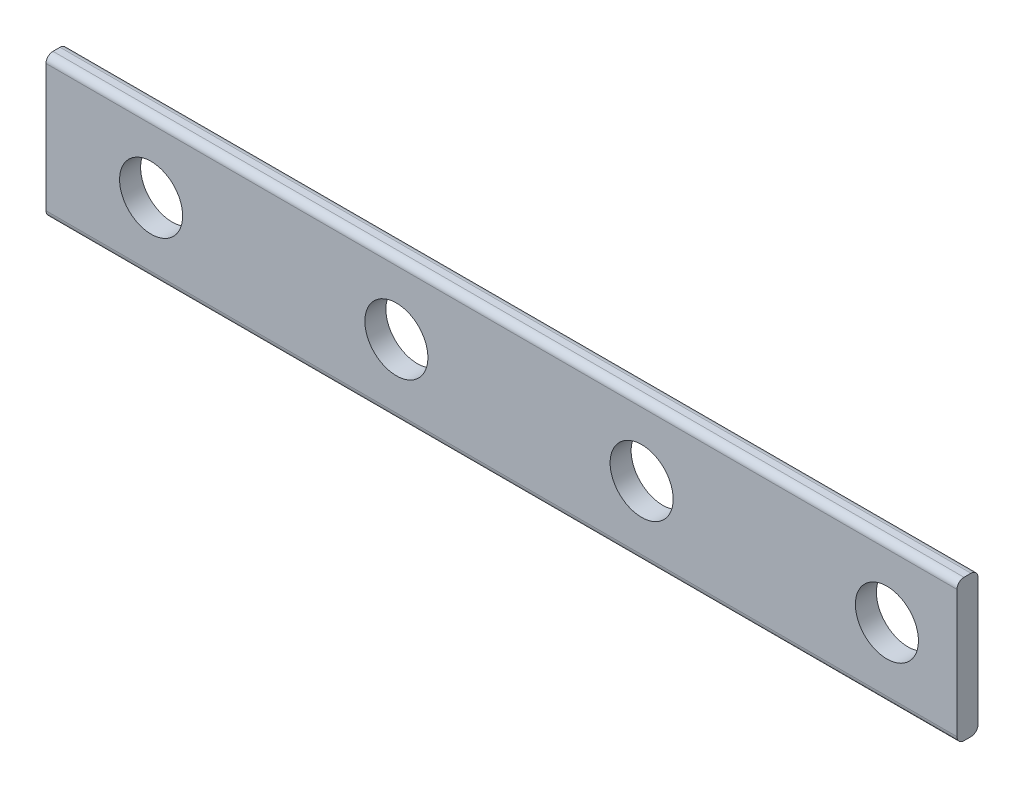
ISO-10303-21;
HEADER;
FILE_DESCRIPTION(('STEP AP214'),'2;1');
FILE_NAME('part.step','',(''),(''),'','','');
FILE_SCHEMA(('AUTOMOTIVE_DESIGN { 1 0 10303 214 1 1 1 1 }'));
ENDSEC;
DATA;
#1=APPLICATION_CONTEXT('core data for automotive mechanical design processes');
#2=APPLICATION_PROTOCOL_DEFINITION('international standard','automotive_design',2000,#1);
#3=PRODUCT_CONTEXT('',#1,'mechanical');
#4=PRODUCT('Part','Part','',(#3));
#5=PRODUCT_RELATED_PRODUCT_CATEGORY('part','',(#4));
#6=PRODUCT_DEFINITION_FORMATION('','',#4);
#7=PRODUCT_DEFINITION_CONTEXT('part definition',#1,'design');
#8=PRODUCT_DEFINITION('design','',#6,#7);
#9=PRODUCT_DEFINITION_SHAPE('','',#8);
#10=(LENGTH_UNIT() NAMED_UNIT(*) SI_UNIT(.MILLI.,.METRE.));
#11=(NAMED_UNIT(*) PLANE_ANGLE_UNIT() SI_UNIT($,.RADIAN.));
#12=(NAMED_UNIT(*) SI_UNIT($,.STERADIAN.) SOLID_ANGLE_UNIT());
#13=UNCERTAINTY_MEASURE_WITH_UNIT(LENGTH_MEASURE(1.E-05),#10,'distance_accuracy_value','');
#14=(GEOMETRIC_REPRESENTATION_CONTEXT(3) GLOBAL_UNCERTAINTY_ASSIGNED_CONTEXT((#13)) GLOBAL_UNIT_ASSIGNED_CONTEXT((#10,
#11,#12)) REPRESENTATION_CONTEXT('',''));
#15=CARTESIAN_POINT('',(0.,0.,0.));
#16=DIRECTION('',(0.,0.,1.));
#17=DIRECTION('',(1.,0.,0.));
#18=AXIS2_PLACEMENT_3D('',#15,#16,#17);
#19=CARTESIAN_POINT('',(0.,0.,3.));
#20=DIRECTION('',(0.,0.,1.));
#21=DIRECTION('',(1.,0.,0.));
#22=AXIS2_PLACEMENT_3D('',#19,#20,#21);
#23=PLANE('',#22);
#24=CARTESIAN_POINT('',(20.,0.,3.));
#25=DIRECTION('',(0.,0.,1.));
#26=DIRECTION('',(1.,0.,0.));
#27=AXIS2_PLACEMENT_3D('',#24,#25,#26);
#28=CIRCLE('',#27,4.5);
#29=CARTESIAN_POINT('',(24.5,0.,3.));
#30=VERTEX_POINT('',#29);
#31=EDGE_CURVE('E252',#30,#30,#28,.T.);
#32=ORIENTED_EDGE('',*,*,#31,.F.);
#33=EDGE_LOOP('',(#32));
#34=FACE_BOUND('',#33,.T.);
#35=CARTESIAN_POINT('',(-50.,0.,3.));
#36=DIRECTION('',(0.,0.,1.));
#37=DIRECTION('',(1.,0.,0.));
#38=AXIS2_PLACEMENT_3D('',#35,#36,#37);
#39=CIRCLE('',#38,4.5);
#40=CARTESIAN_POINT('',(-45.5,0.,3.));
#41=VERTEX_POINT('',#40);
#42=EDGE_CURVE('E183',#41,#41,#39,.T.);
#43=ORIENTED_EDGE('',*,*,#42,.F.);
#44=EDGE_LOOP('',(#43));
#45=FACE_BOUND('',#44,.T.);
#46=DIRECTION('',(0.,1.,0.));
#47=VECTOR('',#46,1.);
#48=CARTESIAN_POINT('',(65.,10.1,3.));
#49=LINE('',#48,#47);
#50=CARTESIAN_POINT('',(65.,-9.09999999999999,3.));
#51=VERTEX_POINT('',#50);
#52=CARTESIAN_POINT('',(65.,9.10000000000001,3.));
#53=VERTEX_POINT('',#52);
#54=EDGE_CURVE('E171',#51,#53,#49,.T.);
#55=ORIENTED_EDGE('',*,*,#54,.T.);
#56=DIRECTION('',(-1.,0.,0.));
#57=VECTOR('',#56,1.);
#58=CARTESIAN_POINT('',(-65.,9.09999999999999,3.));
#59=LINE('',#58,#57);
#60=CARTESIAN_POINT('',(-65.,9.09999999999999,3.));
#61=VERTEX_POINT('',#60);
#62=EDGE_CURVE('E155',#53,#61,#59,.T.);
#63=ORIENTED_EDGE('',*,*,#62,.T.);
#64=DIRECTION('',(0.,-1.,0.));
#65=VECTOR('',#64,1.);
#66=CARTESIAN_POINT('',(-65.,10.1,3.));
#67=LINE('',#66,#65);
#68=CARTESIAN_POINT('',(-65.,-9.09999999999999,3.));
#69=VERTEX_POINT('',#68);
#70=EDGE_CURVE('E113',#61,#69,#67,.T.);
#71=ORIENTED_EDGE('',*,*,#70,.T.);
#72=DIRECTION('',(1.,0.,0.));
#73=VECTOR('',#72,1.);
#74=CARTESIAN_POINT('',(65.,-9.09999999999999,3.));
#75=LINE('',#74,#73);
#76=EDGE_CURVE('E152',#69,#51,#75,.T.);
#77=ORIENTED_EDGE('',*,*,#76,.T.);
#78=EDGE_LOOP('',(#55,#63,#71,#77));
#79=FACE_BOUND('',#78,.T.);
#80=CARTESIAN_POINT('',(-15.,0.,3.));
#81=DIRECTION('',(0.,0.,1.));
#82=DIRECTION('',(1.,0.,0.));
#83=AXIS2_PLACEMENT_3D('',#80,#81,#82);
#84=CIRCLE('',#83,4.5);
#85=CARTESIAN_POINT('',(-10.5,0.,3.));
#86=VERTEX_POINT('',#85);
#87=EDGE_CURVE('E247',#86,#86,#84,.T.);
#88=ORIENTED_EDGE('',*,*,#87,.F.);
#89=EDGE_LOOP('',(#88));
#90=FACE_BOUND('',#89,.T.);
#91=CARTESIAN_POINT('',(55.,0.,3.));
#92=DIRECTION('',(0.,0.,1.));
#93=DIRECTION('',(1.,0.,0.));
#94=AXIS2_PLACEMENT_3D('',#91,#92,#93);
#95=CIRCLE('',#94,4.5);
#96=CARTESIAN_POINT('',(59.5,0.,3.));
#97=VERTEX_POINT('',#96);
#98=EDGE_CURVE('E271',#97,#97,#95,.T.);
#99=ORIENTED_EDGE('',*,*,#98,.F.);
#100=EDGE_LOOP('',(#99));
#101=FACE_BOUND('',#100,.T.);
#102=ADVANCED_FACE('F42',(#34,#45,#79,#90,#101),#23,.T.);
#103=CARTESIAN_POINT('',(0.,0.,0.));
#104=DIRECTION('',(0.,0.,1.));
#105=DIRECTION('',(1.,0.,0.));
#106=AXIS2_PLACEMENT_3D('',#103,#104,#105);
#107=PLANE('',#106);
#108=DIRECTION('',(0.,-1.,0.));
#109=VECTOR('',#108,1.);
#110=CARTESIAN_POINT('',(-65.,10.1,0.));
#111=LINE('',#110,#109);
#112=CARTESIAN_POINT('',(-65.,9.09999999999999,0.));
#113=VERTEX_POINT('',#112);
#114=CARTESIAN_POINT('',(-65.,-9.09999999999999,0.));
#115=VERTEX_POINT('',#114);
#116=EDGE_CURVE('E174',#113,#115,#111,.T.);
#117=ORIENTED_EDGE('',*,*,#116,.F.);
#118=DIRECTION('',(-1.,0.,0.));
#119=VECTOR('',#118,1.);
#120=CARTESIAN_POINT('',(0.,9.1,0.));
#121=LINE('',#120,#119);
#122=CARTESIAN_POINT('',(65.,9.10000000000001,0.));
#123=VERTEX_POINT('',#122);
#124=EDGE_CURVE('E145',#113,#123,#121,.F.);
#125=ORIENTED_EDGE('',*,*,#124,.T.);
#126=DIRECTION('',(0.,1.,0.));
#127=VECTOR('',#126,1.);
#128=CARTESIAN_POINT('',(65.,10.1,0.));
#129=LINE('',#128,#127);
#130=CARTESIAN_POINT('',(65.,-9.09999999999999,0.));
#131=VERTEX_POINT('',#130);
#132=EDGE_CURVE('E177',#131,#123,#129,.T.);
#133=ORIENTED_EDGE('',*,*,#132,.F.);
#134=DIRECTION('',(1.,0.,0.));
#135=VECTOR('',#134,1.);
#136=CARTESIAN_POINT('',(0.,-9.09999999999999,0.));
#137=LINE('',#136,#135);
#138=EDGE_CURVE('E143',#131,#115,#137,.F.);
#139=ORIENTED_EDGE('',*,*,#138,.T.);
#140=EDGE_LOOP('',(#117,#125,#133,#139));
#141=FACE_BOUND('',#140,.T.);
#142=CARTESIAN_POINT('',(-50.,0.,0.));
#143=DIRECTION('',(0.,0.,1.));
#144=DIRECTION('',(1.,0.,0.));
#145=AXIS2_PLACEMENT_3D('',#142,#143,#144);
#146=CIRCLE('',#145,4.5);
#147=CARTESIAN_POINT('',(-45.5,0.,0.));
#148=VERTEX_POINT('',#147);
#149=EDGE_CURVE('E180',#148,#148,#146,.T.);
#150=ORIENTED_EDGE('',*,*,#149,.T.);
#151=EDGE_LOOP('',(#150));
#152=FACE_BOUND('',#151,.T.);
#153=CARTESIAN_POINT('',(-15.,0.,0.));
#154=DIRECTION('',(0.,0.,1.));
#155=DIRECTION('',(1.,0.,0.));
#156=AXIS2_PLACEMENT_3D('',#153,#154,#155);
#157=CIRCLE('',#156,4.5);
#158=CARTESIAN_POINT('',(-10.5,0.,0.));
#159=VERTEX_POINT('',#158);
#160=EDGE_CURVE('E250',#159,#159,#157,.T.);
#161=ORIENTED_EDGE('',*,*,#160,.T.);
#162=EDGE_LOOP('',(#161));
#163=FACE_BOUND('',#162,.T.);
#164=CARTESIAN_POINT('',(20.,0.,0.));
#165=DIRECTION('',(0.,0.,1.));
#166=DIRECTION('',(1.,0.,0.));
#167=AXIS2_PLACEMENT_3D('',#164,#165,#166);
#168=CIRCLE('',#167,4.5);
#169=CARTESIAN_POINT('',(24.5,0.,0.));
#170=VERTEX_POINT('',#169);
#171=EDGE_CURVE('E256',#170,#170,#168,.T.);
#172=ORIENTED_EDGE('',*,*,#171,.T.);
#173=EDGE_LOOP('',(#172));
#174=FACE_BOUND('',#173,.T.);
#175=CARTESIAN_POINT('',(55.,0.,0.));
#176=DIRECTION('',(0.,0.,1.));
#177=DIRECTION('',(1.,0.,0.));
#178=AXIS2_PLACEMENT_3D('',#175,#176,#177);
#179=CIRCLE('',#178,4.5);
#180=CARTESIAN_POINT('',(59.5,0.,0.));
#181=VERTEX_POINT('',#180);
#182=EDGE_CURVE('E270',#181,#181,#179,.T.);
#183=ORIENTED_EDGE('',*,*,#182,.T.);
#184=EDGE_LOOP('',(#183));
#185=FACE_BOUND('',#184,.T.);
#186=ADVANCED_FACE('F189',(#141,#152,#163,#174,#185),#107,.F.);
#187=CARTESIAN_POINT('',(65.,10.1,3.));
#188=DIRECTION('',(-1.,0.,0.));
#189=DIRECTION('',(0.,-1.,0.));
#190=AXIS2_PLACEMENT_3D('',#187,#188,#189);
#191=PLANE('',#190);
#192=ORIENTED_EDGE('',*,*,#132,.T.);
#193=CARTESIAN_POINT('',(65.,9.10000000000001,1.));
#194=DIRECTION('',(-1.,0.,0.));
#195=DIRECTION('',(0.,-1.,0.));
#196=AXIS2_PLACEMENT_3D('',#193,#194,#195);
#197=CIRCLE('',#196,1.);
#198=CARTESIAN_POINT('',(65.,10.1,1.));
#199=VERTEX_POINT('',#198);
#200=EDGE_CURVE('E150',#123,#199,#197,.F.);
#201=ORIENTED_EDGE('',*,*,#200,.T.);
#202=DIRECTION('',(0.,0.,-1.));
#203=VECTOR('',#202,1.);
#204=CARTESIAN_POINT('',(65.,10.1,3.));
#205=LINE('',#204,#203);
#206=CARTESIAN_POINT('',(65.,10.1,2.));
#207=VERTEX_POINT('',#206);
#208=EDGE_CURVE('E129',#207,#199,#205,.T.);
#209=ORIENTED_EDGE('',*,*,#208,.F.);
#210=CARTESIAN_POINT('',(65.,9.10000000000001,2.));
#211=DIRECTION('',(-1.,0.,0.));
#212=DIRECTION('',(0.,-1.,0.));
#213=AXIS2_PLACEMENT_3D('',#210,#211,#212);
#214=CIRCLE('',#213,1.);
#215=EDGE_CURVE('E134',#207,#53,#214,.F.);
#216=ORIENTED_EDGE('',*,*,#215,.T.);
#217=ORIENTED_EDGE('',*,*,#54,.F.);
#218=CARTESIAN_POINT('',(65.,-9.09999999999999,2.));
#219=DIRECTION('',(-1.,0.,0.));
#220=DIRECTION('',(0.,-1.,0.));
#221=AXIS2_PLACEMENT_3D('',#218,#219,#220);
#222=CIRCLE('',#221,1.);
#223=CARTESIAN_POINT('',(65.,-10.1,2.));
#224=VERTEX_POINT('',#223);
#225=EDGE_CURVE('E64',#51,#224,#222,.F.);
#226=ORIENTED_EDGE('',*,*,#225,.T.);
#227=DIRECTION('',(0.,0.,-1.));
#228=VECTOR('',#227,1.);
#229=CARTESIAN_POINT('',(65.,-10.1,3.));
#230=LINE('',#229,#228);
#231=CARTESIAN_POINT('',(65.,-10.1,1.));
#232=VERTEX_POINT('',#231);
#233=EDGE_CURVE('E161',#224,#232,#230,.T.);
#234=ORIENTED_EDGE('',*,*,#233,.T.);
#235=CARTESIAN_POINT('',(65.,-9.09999999999999,1.));
#236=DIRECTION('',(-1.,0.,0.));
#237=DIRECTION('',(0.,-1.,0.));
#238=AXIS2_PLACEMENT_3D('',#235,#236,#237);
#239=CIRCLE('',#238,1.);
#240=EDGE_CURVE('E57',#232,#131,#239,.F.);
#241=ORIENTED_EDGE('',*,*,#240,.T.);
#242=EDGE_LOOP('',(#192,#201,#209,#216,#217,#226,#234,#241));
#243=FACE_BOUND('',#242,.T.);
#244=ADVANCED_FACE('F173',(#243),#191,.F.);
#245=CARTESIAN_POINT('',(-65.,10.1,3.));
#246=DIRECTION('',(0.,-1.,0.));
#247=DIRECTION('',(1.,0.,0.));
#248=AXIS2_PLACEMENT_3D('',#245,#246,#247);
#249=PLANE('',#248);
#250=ORIENTED_EDGE('',*,*,#208,.T.);
#251=DIRECTION('',(-1.,0.,0.));
#252=VECTOR('',#251,1.);
#253=CARTESIAN_POINT('',(-65.,10.1,1.));
#254=LINE('',#253,#252);
#255=CARTESIAN_POINT('',(-65.,10.1,1.));
#256=VERTEX_POINT('',#255);
#257=EDGE_CURVE('E128',#199,#256,#254,.T.);
#258=ORIENTED_EDGE('',*,*,#257,.T.);
#259=DIRECTION('',(0.,0.,-1.));
#260=VECTOR('',#259,1.);
#261=CARTESIAN_POINT('',(-65.,10.1,3.));
#262=LINE('',#261,#260);
#263=CARTESIAN_POINT('',(-65.,10.1,2.));
#264=VERTEX_POINT('',#263);
#265=EDGE_CURVE('E111',#264,#256,#262,.T.);
#266=ORIENTED_EDGE('',*,*,#265,.F.);
#267=DIRECTION('',(-1.,0.,0.));
#268=VECTOR('',#267,1.);
#269=CARTESIAN_POINT('',(65.,10.1,2.));
#270=LINE('',#269,#268);
#271=EDGE_CURVE('E125',#264,#207,#270,.F.);
#272=ORIENTED_EDGE('',*,*,#271,.T.);
#273=EDGE_LOOP('',(#250,#258,#266,#272));
#274=FACE_BOUND('',#273,.T.);
#275=ADVANCED_FACE('F124',(#274),#249,.F.);
#276=CARTESIAN_POINT('',(-65.,10.1,3.));
#277=DIRECTION('',(1.,0.,0.));
#278=DIRECTION('',(0.,0.,-1.));
#279=AXIS2_PLACEMENT_3D('',#276,#277,#278);
#280=PLANE('',#279);
#281=ORIENTED_EDGE('',*,*,#265,.T.);
#282=CARTESIAN_POINT('',(-65.,9.09999999999999,1.));
#283=DIRECTION('',(1.,0.,0.));
#284=DIRECTION('',(0.,0.,-1.));
#285=AXIS2_PLACEMENT_3D('',#282,#283,#284);
#286=CIRCLE('',#285,1.);
#287=EDGE_CURVE('E118',#256,#113,#286,.F.);
#288=ORIENTED_EDGE('',*,*,#287,.T.);
#289=ORIENTED_EDGE('',*,*,#116,.T.);
#290=CARTESIAN_POINT('',(-65.,-9.09999999999999,1.));
#291=DIRECTION('',(1.,0.,0.));
#292=DIRECTION('',(0.,0.,-1.));
#293=AXIS2_PLACEMENT_3D('',#290,#291,#292);
#294=CIRCLE('',#293,1.);
#295=CARTESIAN_POINT('',(-65.,-10.1,1.));
#296=VERTEX_POINT('',#295);
#297=EDGE_CURVE('E119',#115,#296,#294,.F.);
#298=ORIENTED_EDGE('',*,*,#297,.T.);
#299=DIRECTION('',(0.,0.,-1.));
#300=VECTOR('',#299,1.);
#301=CARTESIAN_POINT('',(-65.,-10.1,3.));
#302=LINE('',#301,#300);
#303=CARTESIAN_POINT('',(-65.,-10.1,2.));
#304=VERTEX_POINT('',#303);
#305=EDGE_CURVE('E130',#304,#296,#302,.T.);
#306=ORIENTED_EDGE('',*,*,#305,.F.);
#307=CARTESIAN_POINT('',(-65.,-9.09999999999999,2.));
#308=DIRECTION('',(1.,0.,0.));
#309=DIRECTION('',(0.,0.,-1.));
#310=AXIS2_PLACEMENT_3D('',#307,#308,#309);
#311=CIRCLE('',#310,1.);
#312=EDGE_CURVE('E136',#304,#69,#311,.F.);
#313=ORIENTED_EDGE('',*,*,#312,.T.);
#314=ORIENTED_EDGE('',*,*,#70,.F.);
#315=CARTESIAN_POINT('',(-65.,9.09999999999999,2.));
#316=DIRECTION('',(1.,0.,0.));
#317=DIRECTION('',(0.,0.,-1.));
#318=AXIS2_PLACEMENT_3D('',#315,#316,#317);
#319=CIRCLE('',#318,1.);
#320=EDGE_CURVE('E108',#61,#264,#319,.F.);
#321=ORIENTED_EDGE('',*,*,#320,.T.);
#322=EDGE_LOOP('',(#281,#288,#289,#298,#306,#313,#314,#321));
#323=FACE_BOUND('',#322,.T.);
#324=ADVANCED_FACE('F110',(#323),#280,.F.);
#325=CARTESIAN_POINT('',(-65.,-10.1,3.));
#326=DIRECTION('',(0.,1.,0.));
#327=DIRECTION('',(0.,0.,1.));
#328=AXIS2_PLACEMENT_3D('',#325,#326,#327);
#329=PLANE('',#328);
#330=ORIENTED_EDGE('',*,*,#305,.T.);
#331=DIRECTION('',(1.,0.,0.));
#332=VECTOR('',#331,1.);
#333=CARTESIAN_POINT('',(-65.,-10.1,1.));
#334=LINE('',#333,#332);
#335=EDGE_CURVE('E11',#296,#232,#334,.T.);
#336=ORIENTED_EDGE('',*,*,#335,.T.);
#337=ORIENTED_EDGE('',*,*,#233,.F.);
#338=DIRECTION('',(1.,0.,0.));
#339=VECTOR('',#338,1.);
#340=CARTESIAN_POINT('',(-65.,-10.1,2.));
#341=LINE('',#340,#339);
#342=EDGE_CURVE('E50',#224,#304,#341,.F.);
#343=ORIENTED_EDGE('',*,*,#342,.T.);
#344=EDGE_LOOP('',(#330,#336,#337,#343));
#345=FACE_BOUND('',#344,.T.);
#346=ADVANCED_FACE('F160',(#345),#329,.F.);
#347=CARTESIAN_POINT('',(-50.,0.,3.));
#348=DIRECTION('',(0.,0.,-1.));
#349=DIRECTION('',(-1.,0.,0.));
#350=AXIS2_PLACEMENT_3D('',#347,#348,#349);
#351=CYLINDRICAL_SURFACE('',#350,4.5);
#352=ORIENTED_EDGE('',*,*,#42,.T.);
#353=EDGE_LOOP('',(#352));
#354=FACE_BOUND('',#353,.T.);
#355=ORIENTED_EDGE('',*,*,#149,.F.);
#356=EDGE_LOOP('',(#355));
#357=FACE_BOUND('',#356,.T.);
#358=ADVANCED_FACE('F210',(#354,#357),#351,.F.);
#359=CARTESIAN_POINT('',(-15.,0.,3.));
#360=DIRECTION('',(0.,0.,-1.));
#361=DIRECTION('',(-1.,0.,0.));
#362=AXIS2_PLACEMENT_3D('',#359,#360,#361);
#363=CYLINDRICAL_SURFACE('',#362,4.5);
#364=ORIENTED_EDGE('',*,*,#87,.T.);
#365=EDGE_LOOP('',(#364));
#366=FACE_BOUND('',#365,.T.);
#367=ORIENTED_EDGE('',*,*,#160,.F.);
#368=EDGE_LOOP('',(#367));
#369=FACE_BOUND('',#368,.T.);
#370=ADVANCED_FACE('F233',(#366,#369),#363,.F.);
#371=CARTESIAN_POINT('',(20.,0.,3.));
#372=DIRECTION('',(0.,0.,-1.));
#373=DIRECTION('',(-1.,0.,0.));
#374=AXIS2_PLACEMENT_3D('',#371,#372,#373);
#375=CYLINDRICAL_SURFACE('',#374,4.5);
#376=ORIENTED_EDGE('',*,*,#31,.T.);
#377=EDGE_LOOP('',(#376));
#378=FACE_BOUND('',#377,.T.);
#379=ORIENTED_EDGE('',*,*,#171,.F.);
#380=EDGE_LOOP('',(#379));
#381=FACE_BOUND('',#380,.T.);
#382=ADVANCED_FACE('F227',(#378,#381),#375,.F.);
#383=CARTESIAN_POINT('',(55.,0.,3.));
#384=DIRECTION('',(0.,0.,-1.));
#385=DIRECTION('',(-1.,0.,0.));
#386=AXIS2_PLACEMENT_3D('',#383,#384,#385);
#387=CYLINDRICAL_SURFACE('',#386,4.5);
#388=ORIENTED_EDGE('',*,*,#98,.T.);
#389=EDGE_LOOP('',(#388));
#390=FACE_BOUND('',#389,.T.);
#391=ORIENTED_EDGE('',*,*,#182,.F.);
#392=EDGE_LOOP('',(#391));
#393=FACE_BOUND('',#392,.T.);
#394=ADVANCED_FACE('F222',(#390,#393),#387,.F.);
#395=CARTESIAN_POINT('',(-65.,9.09999999999999,1.));
#396=DIRECTION('',(-1.,0.,0.));
#397=DIRECTION('',(0.,-1.,0.));
#398=AXIS2_PLACEMENT_3D('',#395,#396,#397);
#399=CYLINDRICAL_SURFACE('',#398,1.);
#400=ORIENTED_EDGE('',*,*,#200,.F.);
#401=ORIENTED_EDGE('',*,*,#124,.F.);
#402=ORIENTED_EDGE('',*,*,#287,.F.);
#403=ORIENTED_EDGE('',*,*,#257,.F.);
#404=EDGE_LOOP('',(#400,#401,#402,#403));
#405=FACE_BOUND('',#404,.T.);
#406=ADVANCED_FACE('F198',(#405),#399,.T.);
#407=CARTESIAN_POINT('',(0.,9.1,2.));
#408=DIRECTION('',(1.,0.,0.));
#409=DIRECTION('',(0.,1.,0.));
#410=AXIS2_PLACEMENT_3D('',#407,#408,#409);
#411=CYLINDRICAL_SURFACE('',#410,1.);
#412=ORIENTED_EDGE('',*,*,#215,.F.);
#413=ORIENTED_EDGE('',*,*,#271,.F.);
#414=ORIENTED_EDGE('',*,*,#320,.F.);
#415=ORIENTED_EDGE('',*,*,#62,.F.);
#416=EDGE_LOOP('',(#412,#413,#414,#415));
#417=FACE_BOUND('',#416,.T.);
#418=ADVANCED_FACE('F133',(#417),#411,.T.);
#419=CARTESIAN_POINT('',(-65.,-9.09999999999999,1.));
#420=DIRECTION('',(1.,0.,0.));
#421=DIRECTION('',(0.,0.,-1.));
#422=AXIS2_PLACEMENT_3D('',#419,#420,#421);
#423=CYLINDRICAL_SURFACE('',#422,1.);
#424=ORIENTED_EDGE('',*,*,#297,.F.);
#425=ORIENTED_EDGE('',*,*,#138,.F.);
#426=ORIENTED_EDGE('',*,*,#240,.F.);
#427=ORIENTED_EDGE('',*,*,#335,.F.);
#428=EDGE_LOOP('',(#424,#425,#426,#427));
#429=FACE_BOUND('',#428,.T.);
#430=ADVANCED_FACE('F192',(#429),#423,.T.);
#431=CARTESIAN_POINT('',(0.,-9.09999999999999,2.));
#432=DIRECTION('',(-1.,0.,0.));
#433=DIRECTION('',(0.,0.,1.));
#434=AXIS2_PLACEMENT_3D('',#431,#432,#433);
#435=CYLINDRICAL_SURFACE('',#434,1.);
#436=ORIENTED_EDGE('',*,*,#312,.F.);
#437=ORIENTED_EDGE('',*,*,#342,.F.);
#438=ORIENTED_EDGE('',*,*,#225,.F.);
#439=ORIENTED_EDGE('',*,*,#76,.F.);
#440=EDGE_LOOP('',(#436,#437,#438,#439));
#441=FACE_BOUND('',#440,.T.);
#442=ADVANCED_FACE('F44',(#441),#435,.T.);
#443=CLOSED_SHELL('',(#102,#186,#244,#275,#324,#346,#358,#370,#382,#394,#406,#418,#430,#442));
#444=MANIFOLD_SOLID_BREP('B2',#443);
#445=ADVANCED_BREP_SHAPE_REPRESENTATION('',(#18,#444),#14);
#446=SHAPE_DEFINITION_REPRESENTATION(#9,#445);
ENDSEC;
END-ISO-10303-21;
